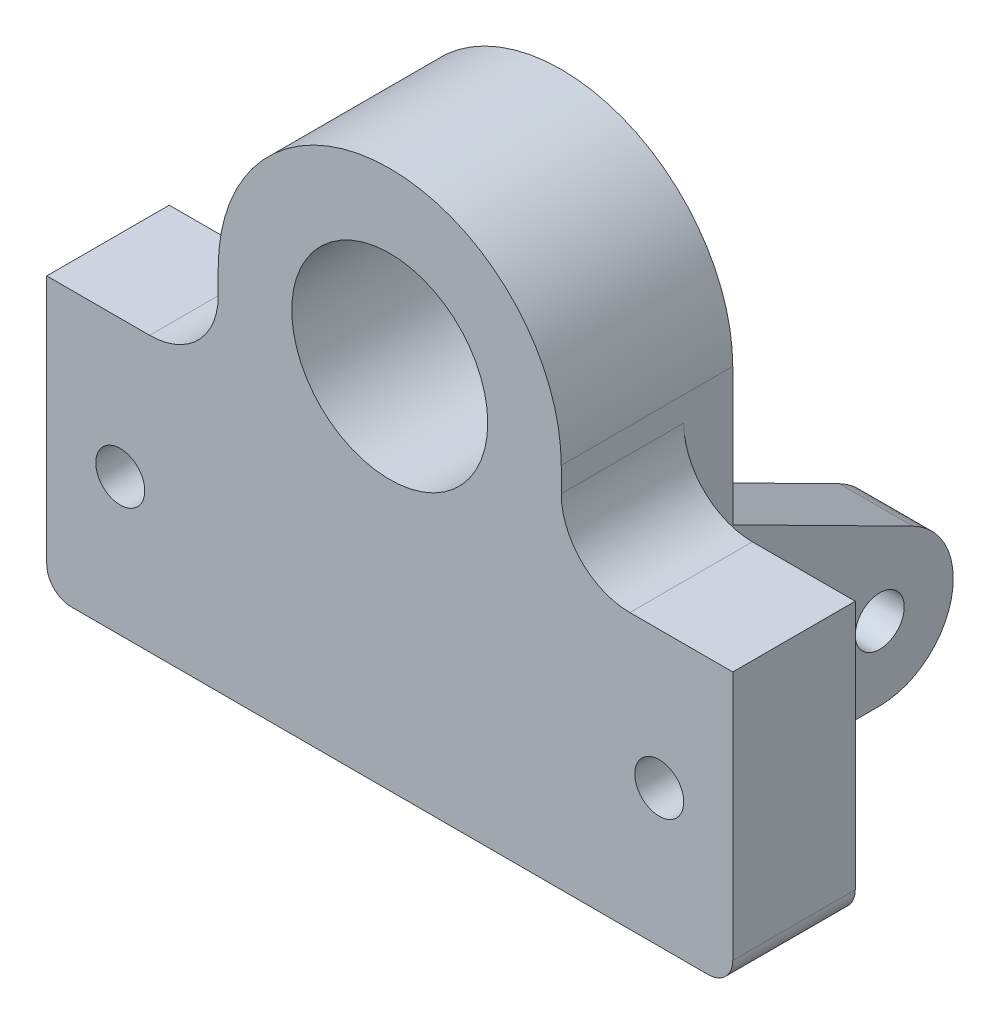
ISO-10303-21;
HEADER;
FILE_DESCRIPTION(('STEP AP214'),'2;1');
FILE_NAME('part.step','',(''),(''),'','','');
FILE_SCHEMA(('AUTOMOTIVE_DESIGN { 1 0 10303 214 1 1 1 1 }'));
ENDSEC;
DATA;
#1=APPLICATION_CONTEXT('core data for automotive mechanical design processes');
#2=APPLICATION_PROTOCOL_DEFINITION('international standard','automotive_design',2000,#1);
#3=PRODUCT_CONTEXT('',#1,'mechanical');
#4=PRODUCT('Part','Part','',(#3));
#5=PRODUCT_RELATED_PRODUCT_CATEGORY('part','',(#4));
#6=PRODUCT_DEFINITION_FORMATION('','',#4);
#7=PRODUCT_DEFINITION_CONTEXT('part definition',#1,'design');
#8=PRODUCT_DEFINITION('design','',#6,#7);
#9=PRODUCT_DEFINITION_SHAPE('','',#8);
#10=(LENGTH_UNIT() NAMED_UNIT(*) SI_UNIT(.MILLI.,.METRE.));
#11=(NAMED_UNIT(*) PLANE_ANGLE_UNIT() SI_UNIT($,.RADIAN.));
#12=(NAMED_UNIT(*) SI_UNIT($,.STERADIAN.) SOLID_ANGLE_UNIT());
#13=UNCERTAINTY_MEASURE_WITH_UNIT(LENGTH_MEASURE(1.E-05),#10,'distance_accuracy_value','');
#14=(GEOMETRIC_REPRESENTATION_CONTEXT(3) GLOBAL_UNCERTAINTY_ASSIGNED_CONTEXT((#13)) GLOBAL_UNIT_ASSIGNED_CONTEXT((#10,
#11,#12)) REPRESENTATION_CONTEXT('',''));
#15=CARTESIAN_POINT('',(0.,0.,0.));
#16=DIRECTION('',(0.,0.,1.));
#17=DIRECTION('',(1.,0.,0.));
#18=AXIS2_PLACEMENT_3D('',#15,#16,#17);
#19=CARTESIAN_POINT('',(0.,0.,-10.));
#20=DIRECTION('',(0.,0.,1.));
#21=DIRECTION('',(1.,0.,0.));
#22=AXIS2_PLACEMENT_3D('',#19,#20,#21);
#23=PLANE('',#22);
#24=CARTESIAN_POINT('',(0.,75.,-10.));
#25=DIRECTION('',(0.,0.,1.));
#26=DIRECTION('',(1.,0.,0.));
#27=AXIS2_PLACEMENT_3D('',#24,#25,#26);
#28=CIRCLE('',#27,20.);
#29=CARTESIAN_POINT('',(20.,75.,-10.));
#30=VERTEX_POINT('',#29);
#31=EDGE_CURVE('E224',#30,#30,#28,.T.);
#32=ORIENTED_EDGE('',*,*,#31,.T.);
#33=EDGE_LOOP('',(#32));
#34=FACE_BOUND('',#33,.T.);
#35=DIRECTION('',(0.,-1.,0.));
#36=VECTOR('',#35,1.);
#37=CARTESIAN_POINT('',(-20.,47.,-10.));
#38=LINE('',#37,#36);
#39=CARTESIAN_POINT('',(-20.,47.,-10.));
#40=VERTEX_POINT('',#39);
#41=CARTESIAN_POINT('',(-20.,0.,-10.));
#42=VERTEX_POINT('',#41);
#43=EDGE_CURVE('E50',#40,#42,#38,.T.);
#44=ORIENTED_EDGE('',*,*,#43,.F.);
#45=DIRECTION('',(-1.,0.,0.));
#46=VECTOR('',#45,1.);
#47=CARTESIAN_POINT('',(-20.,47.,-10.));
#48=LINE('',#47,#46);
#49=CARTESIAN_POINT('',(-35.,47.,-10.));
#50=VERTEX_POINT('',#49);
#51=EDGE_CURVE('E55',#40,#50,#48,.T.);
#52=ORIENTED_EDGE('',*,*,#51,.T.);
#53=DIRECTION('',(0.,-1.,0.));
#54=VECTOR('',#53,1.);
#55=CARTESIAN_POINT('',(-35.,0.,-10.));
#56=LINE('',#55,#54);
#57=CARTESIAN_POINT('',(-35.,75.,-10.));
#58=VERTEX_POINT('',#57);
#59=EDGE_CURVE('E237',#58,#50,#56,.T.);
#60=ORIENTED_EDGE('',*,*,#59,.F.);
#61=CARTESIAN_POINT('',(0.,75.,-10.));
#62=DIRECTION('',(0.,0.,1.));
#63=DIRECTION('',(1.,0.,0.));
#64=AXIS2_PLACEMENT_3D('',#61,#62,#63);
#65=CIRCLE('',#64,35.);
#66=CARTESIAN_POINT('',(35.,75.,-10.));
#67=VERTEX_POINT('',#66);
#68=EDGE_CURVE('E234',#67,#58,#65,.T.);
#69=ORIENTED_EDGE('',*,*,#68,.F.);
#70=DIRECTION('',(0.,-1.,0.));
#71=VECTOR('',#70,1.);
#72=CARTESIAN_POINT('',(35.,0.,-10.));
#73=LINE('',#72,#71);
#74=CARTESIAN_POINT('',(35.,47.,-10.));
#75=VERTEX_POINT('',#74);
#76=EDGE_CURVE('E231',#67,#75,#73,.T.);
#77=ORIENTED_EDGE('',*,*,#76,.T.);
#78=DIRECTION('',(1.,0.,0.));
#79=VECTOR('',#78,1.);
#80=CARTESIAN_POINT('',(20.,47.,-10.));
#81=LINE('',#80,#79);
#82=CARTESIAN_POINT('',(20.,47.,-10.));
#83=VERTEX_POINT('',#82);
#84=EDGE_CURVE('E222',#83,#75,#81,.T.);
#85=ORIENTED_EDGE('',*,*,#84,.F.);
#86=DIRECTION('',(0.,-1.,0.));
#87=VECTOR('',#86,1.);
#88=CARTESIAN_POINT('',(20.,47.,-10.));
#89=LINE('',#88,#87);
#90=CARTESIAN_POINT('',(20.,0.,-10.));
#91=VERTEX_POINT('',#90);
#92=EDGE_CURVE('E214',#83,#91,#89,.T.);
#93=ORIENTED_EDGE('',*,*,#92,.T.);
#94=DIRECTION('',(1.,0.,0.));
#95=VECTOR('',#94,1.);
#96=CARTESIAN_POINT('',(0.,0.,-10.));
#97=LINE('',#96,#95);
#98=EDGE_CURVE('E239',#42,#91,#97,.T.);
#99=ORIENTED_EDGE('',*,*,#98,.F.);
#100=EDGE_LOOP('',(#44,#52,#60,#69,#77,#85,#93,#99));
#101=FACE_BOUND('',#100,.T.);
#102=ADVANCED_FACE('F33',(#34,#101),#23,.F.);
#103=CARTESIAN_POINT('',(0.,0.,0.));
#104=DIRECTION('',(0.,0.,1.));
#105=DIRECTION('',(1.,0.,0.));
#106=AXIS2_PLACEMENT_3D('',#103,#104,#105);
#107=PLANE('',#106);
#108=CARTESIAN_POINT('',(55.,28.,0.));
#109=DIRECTION('',(0.,0.,1.));
#110=DIRECTION('',(1.,0.,0.));
#111=AXIS2_PLACEMENT_3D('',#108,#109,#110);
#112=CIRCLE('',#111,5.);
#113=CARTESIAN_POINT('',(60.,28.,0.));
#114=VERTEX_POINT('',#113);
#115=EDGE_CURVE('E251',#114,#114,#112,.T.);
#116=ORIENTED_EDGE('',*,*,#115,.T.);
#117=EDGE_LOOP('',(#116));
#118=FACE_BOUND('',#117,.T.);
#119=DIRECTION('',(0.,-1.,0.));
#120=VECTOR('',#119,1.);
#121=CARTESIAN_POINT('',(35.,0.,0.));
#122=LINE('',#121,#120);
#123=CARTESIAN_POINT('',(35.,70.,0.));
#124=VERTEX_POINT('',#123);
#125=CARTESIAN_POINT('',(35.,0.,0.));
#126=VERTEX_POINT('',#125);
#127=EDGE_CURVE('E11',#124,#126,#122,.T.);
#128=ORIENTED_EDGE('',*,*,#127,.F.);
#129=CARTESIAN_POINT('',(49.,70.,0.));
#130=DIRECTION('',(0.,0.,1.));
#131=DIRECTION('',(1.,0.,0.));
#132=AXIS2_PLACEMENT_3D('',#129,#130,#131);
#133=CIRCLE('',#132,14.);
#134=CARTESIAN_POINT('',(49.,56.,0.));
#135=VERTEX_POINT('',#134);
#136=EDGE_CURVE('E316',#124,#135,#133,.T.);
#137=ORIENTED_EDGE('',*,*,#136,.T.);
#138=DIRECTION('',(-1.,0.,0.));
#139=VECTOR('',#138,1.);
#140=CARTESIAN_POINT('',(0.,56.,0.));
#141=LINE('',#140,#139);
#142=CARTESIAN_POINT('',(70.,56.,0.));
#143=VERTEX_POINT('',#142);
#144=EDGE_CURVE('E287',#143,#135,#141,.T.);
#145=ORIENTED_EDGE('',*,*,#144,.F.);
#146=DIRECTION('',(0.,1.,0.));
#147=VECTOR('',#146,1.);
#148=CARTESIAN_POINT('',(70.,0.,0.));
#149=LINE('',#148,#147);
#150=CARTESIAN_POINT('',(70.,5.,0.));
#151=VERTEX_POINT('',#150);
#152=EDGE_CURVE('E285',#151,#143,#149,.T.);
#153=ORIENTED_EDGE('',*,*,#152,.F.);
#154=CARTESIAN_POINT('',(65.,5.,0.));
#155=DIRECTION('',(0.,0.,1.));
#156=DIRECTION('',(1.,0.,0.));
#157=AXIS2_PLACEMENT_3D('',#154,#155,#156);
#158=CIRCLE('',#157,5.);
#159=CARTESIAN_POINT('',(65.,0.,0.));
#160=VERTEX_POINT('',#159);
#161=EDGE_CURVE('E330',#151,#160,#158,.F.);
#162=ORIENTED_EDGE('',*,*,#161,.T.);
#163=DIRECTION('',(1.,0.,0.));
#164=VECTOR('',#163,1.);
#165=CARTESIAN_POINT('',(0.,0.,0.));
#166=LINE('',#165,#164);
#167=EDGE_CURVE('E282',#126,#160,#166,.T.);
#168=ORIENTED_EDGE('',*,*,#167,.F.);
#169=EDGE_LOOP('',(#128,#137,#145,#153,#162,#168));
#170=FACE_BOUND('',#169,.T.);
#171=ADVANCED_FACE('F353',(#118,#170),#107,.F.);
#172=CARTESIAN_POINT('',(0.,0.,25.));
#173=DIRECTION('',(0.,1.,0.));
#174=DIRECTION('',(0.,0.,1.));
#175=AXIS2_PLACEMENT_3D('',#172,#173,#174);
#176=PLANE('',#175);
#177=ORIENTED_EDGE('',*,*,#98,.T.);
#178=DIRECTION('',(0.,0.,-1.));
#179=VECTOR('',#178,1.);
#180=CARTESIAN_POINT('',(20.,0.,-10.));
#181=LINE('',#180,#179);
#182=CARTESIAN_POINT('',(20.,0.,-40.));
#183=VERTEX_POINT('',#182);
#184=EDGE_CURVE('E205',#91,#183,#181,.T.);
#185=ORIENTED_EDGE('',*,*,#184,.T.);
#186=DIRECTION('',(1.,0.,0.));
#187=VECTOR('',#186,1.);
#188=CARTESIAN_POINT('',(20.,0.,-40.));
#189=LINE('',#188,#187);
#190=CARTESIAN_POINT('',(35.,0.,-40.));
#191=VERTEX_POINT('',#190);
#192=EDGE_CURVE('E217',#183,#191,#189,.T.);
#193=ORIENTED_EDGE('',*,*,#192,.T.);
#194=DIRECTION('',(0.,0.,1.));
#195=VECTOR('',#194,1.);
#196=CARTESIAN_POINT('',(35.,0.,-10.));
#197=LINE('',#196,#195);
#198=EDGE_CURVE('E243',#191,#126,#197,.T.);
#199=ORIENTED_EDGE('',*,*,#198,.T.);
#200=ORIENTED_EDGE('',*,*,#167,.T.);
#201=DIRECTION('',(0.,0.,-1.));
#202=VECTOR('',#201,1.);
#203=CARTESIAN_POINT('',(65.,0.,25.));
#204=LINE('',#203,#202);
#205=CARTESIAN_POINT('',(65.,0.,25.));
#206=VERTEX_POINT('',#205);
#207=EDGE_CURVE('E325',#160,#206,#204,.F.);
#208=ORIENTED_EDGE('',*,*,#207,.T.);
#209=DIRECTION('',(1.,0.,0.));
#210=VECTOR('',#209,1.);
#211=CARTESIAN_POINT('',(0.,0.,25.));
#212=LINE('',#211,#210);
#213=CARTESIAN_POINT('',(-65.,0.,25.));
#214=VERTEX_POINT('',#213);
#215=EDGE_CURVE('E250',#214,#206,#212,.T.);
#216=ORIENTED_EDGE('',*,*,#215,.F.);
#217=DIRECTION('',(0.,0.,-1.));
#218=VECTOR('',#217,1.);
#219=CARTESIAN_POINT('',(-65.,0.,25.));
#220=LINE('',#219,#218);
#221=CARTESIAN_POINT('',(-65.,0.,0.));
#222=VERTEX_POINT('',#221);
#223=EDGE_CURVE('E327',#214,#222,#220,.T.);
#224=ORIENTED_EDGE('',*,*,#223,.T.);
#225=CARTESIAN_POINT('',(-35.,0.,0.));
#226=VERTEX_POINT('',#225);
#227=EDGE_CURVE('E283',#222,#226,#166,.T.);
#228=ORIENTED_EDGE('',*,*,#227,.T.);
#229=DIRECTION('',(0.,0.,1.));
#230=VECTOR('',#229,1.);
#231=CARTESIAN_POINT('',(-35.,0.,-10.));
#232=LINE('',#231,#230);
#233=CARTESIAN_POINT('',(-35.,0.,-40.));
#234=VERTEX_POINT('',#233);
#235=EDGE_CURVE('E191',#234,#226,#232,.T.);
#236=ORIENTED_EDGE('',*,*,#235,.F.);
#237=DIRECTION('',(-1.,0.,0.));
#238=VECTOR('',#237,1.);
#239=CARTESIAN_POINT('',(-20.,0.,-40.));
#240=LINE('',#239,#238);
#241=CARTESIAN_POINT('',(-20.,0.,-40.));
#242=VERTEX_POINT('',#241);
#243=EDGE_CURVE('E177',#242,#234,#240,.T.);
#244=ORIENTED_EDGE('',*,*,#243,.F.);
#245=DIRECTION('',(0.,0.,-1.));
#246=VECTOR('',#245,1.);
#247=CARTESIAN_POINT('',(-20.,0.,-10.));
#248=LINE('',#247,#246);
#249=EDGE_CURVE('E182',#42,#242,#248,.T.);
#250=ORIENTED_EDGE('',*,*,#249,.F.);
#251=EDGE_LOOP('',(#177,#185,#193,#199,#200,#208,#216,#224,#228,#236,#244,#250));
#252=FACE_BOUND('',#251,.T.);
#253=ADVANCED_FACE('F189',(#252),#176,.F.);
#254=CARTESIAN_POINT('',(70.,0.,25.));
#255=DIRECTION('',(-1.,0.,0.));
#256=DIRECTION('',(0.,0.,1.));
#257=AXIS2_PLACEMENT_3D('',#254,#255,#256);
#258=PLANE('',#257);
#259=DIRECTION('',(0.,1.,0.));
#260=VECTOR('',#259,1.);
#261=CARTESIAN_POINT('',(70.,0.,25.));
#262=LINE('',#261,#260);
#263=CARTESIAN_POINT('',(70.,5.,25.));
#264=VERTEX_POINT('',#263);
#265=CARTESIAN_POINT('',(70.,56.,25.));
#266=VERTEX_POINT('',#265);
#267=EDGE_CURVE('E254',#264,#266,#262,.T.);
#268=ORIENTED_EDGE('',*,*,#267,.F.);
#269=DIRECTION('',(0.,0.,-1.));
#270=VECTOR('',#269,1.);
#271=CARTESIAN_POINT('',(70.,5.,25.));
#272=LINE('',#271,#270);
#273=EDGE_CURVE('E37',#264,#151,#272,.T.);
#274=ORIENTED_EDGE('',*,*,#273,.T.);
#275=ORIENTED_EDGE('',*,*,#152,.T.);
#276=DIRECTION('',(0.,0.,-1.));
#277=VECTOR('',#276,1.);
#278=CARTESIAN_POINT('',(70.,56.,25.));
#279=LINE('',#278,#277);
#280=EDGE_CURVE('E303',#266,#143,#279,.T.);
#281=ORIENTED_EDGE('',*,*,#280,.F.);
#282=EDGE_LOOP('',(#268,#274,#275,#281));
#283=FACE_BOUND('',#282,.T.);
#284=ADVANCED_FACE('F347',(#283),#258,.F.);
#285=CARTESIAN_POINT('',(0.,56.,25.));
#286=DIRECTION('',(0.,-1.,0.));
#287=DIRECTION('',(0.,0.,-1.));
#288=AXIS2_PLACEMENT_3D('',#285,#286,#287);
#289=PLANE('',#288);
#290=ORIENTED_EDGE('',*,*,#144,.T.);
#291=DIRECTION('',(0.,0.,-1.));
#292=VECTOR('',#291,1.);
#293=CARTESIAN_POINT('',(49.,56.,25.));
#294=LINE('',#293,#292);
#295=CARTESIAN_POINT('',(49.,56.,25.));
#296=VERTEX_POINT('',#295);
#297=EDGE_CURVE('E309',#135,#296,#294,.F.);
#298=ORIENTED_EDGE('',*,*,#297,.T.);
#299=DIRECTION('',(-1.,0.,0.));
#300=VECTOR('',#299,1.);
#301=CARTESIAN_POINT('',(0.,56.,25.));
#302=LINE('',#301,#300);
#303=EDGE_CURVE('E256',#266,#296,#302,.T.);
#304=ORIENTED_EDGE('',*,*,#303,.F.);
#305=ORIENTED_EDGE('',*,*,#280,.T.);
#306=EDGE_LOOP('',(#290,#298,#304,#305));
#307=FACE_BOUND('',#306,.T.);
#308=ADVANCED_FACE('F359',(#307),#289,.F.);
#309=CARTESIAN_POINT('',(35.,0.,25.));
#310=DIRECTION('',(1.,0.,0.));
#311=DIRECTION('',(0.,0.,-1.));
#312=AXIS2_PLACEMENT_3D('',#309,#310,#311);
#313=PLANE('',#312);
#314=ORIENTED_EDGE('',*,*,#127,.T.);
#315=ORIENTED_EDGE('',*,*,#198,.F.);
#316=CARTESIAN_POINT('',(35.,15.,-40.));
#317=DIRECTION('',(1.,0.,0.));
#318=DIRECTION('',(0.,0.,-1.));
#319=AXIS2_PLACEMENT_3D('',#316,#317,#318);
#320=CIRCLE('',#319,15.);
#321=CARTESIAN_POINT('',(35.,28.3828053331458,-46.7749923553555));
#322=VERTEX_POINT('',#321);
#323=EDGE_CURVE('E201',#191,#322,#320,.T.);
#324=ORIENTED_EDGE('',*,*,#323,.T.);
#325=DIRECTION('',(0.,0.451666157023699,0.892187022209718));
#326=VECTOR('',#325,1.);
#327=CARTESIAN_POINT('',(35.,28.3828053331458,-46.7749923553555));
#328=LINE('',#327,#326);
#329=EDGE_CURVE('E209',#322,#75,#328,.T.);
#330=ORIENTED_EDGE('',*,*,#329,.T.);
#331=ORIENTED_EDGE('',*,*,#76,.F.);
#332=DIRECTION('',(0.,0.,-1.));
#333=VECTOR('',#332,1.);
#334=CARTESIAN_POINT('',(35.,75.,25.));
#335=LINE('',#334,#333);
#336=CARTESIAN_POINT('',(35.,75.,25.));
#337=VERTEX_POINT('',#336);
#338=EDGE_CURVE('E301',#337,#67,#335,.T.);
#339=ORIENTED_EDGE('',*,*,#338,.F.);
#340=DIRECTION('',(0.,-1.,0.));
#341=VECTOR('',#340,1.);
#342=CARTESIAN_POINT('',(35.,0.,25.));
#343=LINE('',#342,#341);
#344=CARTESIAN_POINT('',(35.,70.,25.));
#345=VERTEX_POINT('',#344);
#346=EDGE_CURVE('E259',#337,#345,#343,.T.);
#347=ORIENTED_EDGE('',*,*,#346,.T.);
#348=DIRECTION('',(0.,0.,-1.));
#349=VECTOR('',#348,1.);
#350=CARTESIAN_POINT('',(35.,70.,25.));
#351=LINE('',#350,#349);
#352=EDGE_CURVE('E306',#345,#124,#351,.T.);
#353=ORIENTED_EDGE('',*,*,#352,.T.);
#354=EDGE_LOOP('',(#314,#315,#324,#330,#331,#339,#347,#353));
#355=FACE_BOUND('',#354,.T.);
#356=CARTESIAN_POINT('',(35.,15.,-40.));
#357=DIRECTION('',(1.,0.,0.));
#358=DIRECTION('',(0.,0.,-1.));
#359=AXIS2_PLACEMENT_3D('',#356,#357,#358);
#360=CIRCLE('',#359,5.);
#361=CARTESIAN_POINT('',(35.,15.,-45.));
#362=VERTEX_POINT('',#361);
#363=EDGE_CURVE('E202',#362,#362,#360,.T.);
#364=ORIENTED_EDGE('',*,*,#363,.F.);
#365=EDGE_LOOP('',(#364));
#366=FACE_BOUND('',#365,.T.);
#367=ADVANCED_FACE('F369',(#355,#366),#313,.T.);
#368=CARTESIAN_POINT('',(0.,75.,25.));
#369=DIRECTION('',(0.,0.,-1.));
#370=DIRECTION('',(-1.,0.,0.));
#371=AXIS2_PLACEMENT_3D('',#368,#369,#370);
#372=CYLINDRICAL_SURFACE('',#371,35.);
#373=ORIENTED_EDGE('',*,*,#338,.T.);
#374=ORIENTED_EDGE('',*,*,#68,.T.);
#375=DIRECTION('',(0.,0.,-1.));
#376=VECTOR('',#375,1.);
#377=CARTESIAN_POINT('',(-35.,75.,25.));
#378=LINE('',#377,#376);
#379=CARTESIAN_POINT('',(-35.,75.,25.));
#380=VERTEX_POINT('',#379);
#381=EDGE_CURVE('E299',#380,#58,#378,.T.);
#382=ORIENTED_EDGE('',*,*,#381,.F.);
#383=CARTESIAN_POINT('',(0.,75.,25.));
#384=DIRECTION('',(0.,0.,1.));
#385=DIRECTION('',(1.,0.,0.));
#386=AXIS2_PLACEMENT_3D('',#383,#384,#385);
#387=CIRCLE('',#386,35.);
#388=EDGE_CURVE('E262',#337,#380,#387,.T.);
#389=ORIENTED_EDGE('',*,*,#388,.F.);
#390=EDGE_LOOP('',(#373,#374,#382,#389));
#391=FACE_BOUND('',#390,.T.);
#392=ADVANCED_FACE('F376',(#391),#372,.T.);
#393=CARTESIAN_POINT('',(-35.,0.,25.));
#394=DIRECTION('',(1.,0.,0.));
#395=DIRECTION('',(0.,0.,-1.));
#396=AXIS2_PLACEMENT_3D('',#393,#394,#395);
#397=PLANE('',#396);
#398=ORIENTED_EDGE('',*,*,#381,.T.);
#399=ORIENTED_EDGE('',*,*,#59,.T.);
#400=DIRECTION('',(0.,0.451666157023699,0.892187022209718));
#401=VECTOR('',#400,1.);
#402=CARTESIAN_POINT('',(-35.,28.3828053331458,-46.7749923553555));
#403=LINE('',#402,#401);
#404=CARTESIAN_POINT('',(-35.,28.3828053331458,-46.7749923553555));
#405=VERTEX_POINT('',#404);
#406=EDGE_CURVE('E187',#405,#50,#403,.T.);
#407=ORIENTED_EDGE('',*,*,#406,.F.);
#408=CARTESIAN_POINT('',(-35.,15.,-40.));
#409=DIRECTION('',(1.,0.,0.));
#410=DIRECTION('',(0.,0.,-1.));
#411=AXIS2_PLACEMENT_3D('',#408,#409,#410);
#412=CIRCLE('',#411,15.);
#413=EDGE_CURVE('E402',#234,#405,#412,.T.);
#414=ORIENTED_EDGE('',*,*,#413,.F.);
#415=ORIENTED_EDGE('',*,*,#235,.T.);
#416=DIRECTION('',(0.,-1.,0.));
#417=VECTOR('',#416,1.);
#418=CARTESIAN_POINT('',(-35.,0.,0.));
#419=LINE('',#418,#417);
#420=CARTESIAN_POINT('',(-35.,70.,0.));
#421=VERTEX_POINT('',#420);
#422=EDGE_CURVE('E42',#421,#226,#419,.T.);
#423=ORIENTED_EDGE('',*,*,#422,.F.);
#424=DIRECTION('',(0.,0.,-1.));
#425=VECTOR('',#424,1.);
#426=CARTESIAN_POINT('',(-35.,70.,25.));
#427=LINE('',#426,#425);
#428=CARTESIAN_POINT('',(-35.,70.,25.));
#429=VERTEX_POINT('',#428);
#430=EDGE_CURVE('E314',#421,#429,#427,.F.);
#431=ORIENTED_EDGE('',*,*,#430,.T.);
#432=DIRECTION('',(0.,-1.,0.));
#433=VECTOR('',#432,1.);
#434=CARTESIAN_POINT('',(-35.,0.,25.));
#435=LINE('',#434,#433);
#436=EDGE_CURVE('E264',#380,#429,#435,.T.);
#437=ORIENTED_EDGE('',*,*,#436,.F.);
#438=EDGE_LOOP('',(#398,#399,#407,#414,#415,#423,#431,#437));
#439=FACE_BOUND('',#438,.T.);
#440=CARTESIAN_POINT('',(-35.,15.,-40.));
#441=DIRECTION('',(1.,0.,0.));
#442=DIRECTION('',(0.,0.,-1.));
#443=AXIS2_PLACEMENT_3D('',#440,#441,#442);
#444=CIRCLE('',#443,5.);
#445=CARTESIAN_POINT('',(-35.,15.,-45.));
#446=VERTEX_POINT('',#445);
#447=EDGE_CURVE('E408',#446,#446,#444,.T.);
#448=ORIENTED_EDGE('',*,*,#447,.T.);
#449=EDGE_LOOP('',(#448));
#450=FACE_BOUND('',#449,.T.);
#451=ADVANCED_FACE('F399',(#439,#450),#397,.F.);
#452=CARTESIAN_POINT('',(0.,56.,25.));
#453=DIRECTION('',(0.,1.,0.));
#454=DIRECTION('',(0.,0.,1.));
#455=AXIS2_PLACEMENT_3D('',#452,#453,#454);
#456=PLANE('',#455);
#457=DIRECTION('',(1.,0.,0.));
#458=VECTOR('',#457,1.);
#459=CARTESIAN_POINT('',(0.,56.,25.));
#460=LINE('',#459,#458);
#461=CARTESIAN_POINT('',(-70.,56.,25.));
#462=VERTEX_POINT('',#461);
#463=CARTESIAN_POINT('',(-49.,56.,25.));
#464=VERTEX_POINT('',#463);
#465=EDGE_CURVE('E267',#462,#464,#460,.T.);
#466=ORIENTED_EDGE('',*,*,#465,.T.);
#467=DIRECTION('',(0.,0.,-1.));
#468=VECTOR('',#467,1.);
#469=CARTESIAN_POINT('',(-49.,56.,25.));
#470=LINE('',#469,#468);
#471=CARTESIAN_POINT('',(-49.,56.,0.));
#472=VERTEX_POINT('',#471);
#473=EDGE_CURVE('E311',#464,#472,#470,.T.);
#474=ORIENTED_EDGE('',*,*,#473,.T.);
#475=DIRECTION('',(1.,0.,0.));
#476=VECTOR('',#475,1.);
#477=CARTESIAN_POINT('',(0.,56.,0.));
#478=LINE('',#477,#476);
#479=CARTESIAN_POINT('',(-70.,56.,0.));
#480=VERTEX_POINT('',#479);
#481=EDGE_CURVE('E290',#480,#472,#478,.T.);
#482=ORIENTED_EDGE('',*,*,#481,.F.);
#483=DIRECTION('',(0.,0.,-1.));
#484=VECTOR('',#483,1.);
#485=CARTESIAN_POINT('',(-70.,56.,25.));
#486=LINE('',#485,#484);
#487=EDGE_CURVE('E279',#462,#480,#486,.T.);
#488=ORIENTED_EDGE('',*,*,#487,.F.);
#489=EDGE_LOOP('',(#466,#474,#482,#488));
#490=FACE_BOUND('',#489,.T.);
#491=ADVANCED_FACE('F387',(#490),#456,.T.);
#492=CARTESIAN_POINT('',(0.,75.,25.));
#493=DIRECTION('',(0.,0.,-1.));
#494=DIRECTION('',(-1.,0.,0.));
#495=AXIS2_PLACEMENT_3D('',#492,#493,#494);
#496=CYLINDRICAL_SURFACE('',#495,20.);
#497=CARTESIAN_POINT('',(0.,75.,25.));
#498=DIRECTION('',(0.,0.,1.));
#499=DIRECTION('',(1.,0.,0.));
#500=AXIS2_PLACEMENT_3D('',#497,#498,#499);
#501=CIRCLE('',#500,20.);
#502=CARTESIAN_POINT('',(20.,75.,25.));
#503=VERTEX_POINT('',#502);
#504=EDGE_CURVE('E273',#503,#503,#501,.T.);
#505=ORIENTED_EDGE('',*,*,#504,.T.);
#506=EDGE_LOOP('',(#505));
#507=FACE_BOUND('',#506,.T.);
#508=ORIENTED_EDGE('',*,*,#31,.F.);
#509=EDGE_LOOP('',(#508));
#510=FACE_BOUND('',#509,.T.);
#511=ADVANCED_FACE('F448',(#507,#510),#496,.F.);
#512=CARTESIAN_POINT('',(-70.,0.,25.));
#513=DIRECTION('',(1.,0.,0.));
#514=DIRECTION('',(0.,0.,-1.));
#515=AXIS2_PLACEMENT_3D('',#512,#513,#514);
#516=PLANE('',#515);
#517=DIRECTION('',(0.,-1.,0.));
#518=VECTOR('',#517,1.);
#519=CARTESIAN_POINT('',(-70.,0.,0.));
#520=LINE('',#519,#518);
#521=CARTESIAN_POINT('',(-70.,5.,0.));
#522=VERTEX_POINT('',#521);
#523=EDGE_CURVE('E293',#480,#522,#520,.T.);
#524=ORIENTED_EDGE('',*,*,#523,.T.);
#525=DIRECTION('',(0.,0.,-1.));
#526=VECTOR('',#525,1.);
#527=CARTESIAN_POINT('',(-70.,5.,25.));
#528=LINE('',#527,#526);
#529=CARTESIAN_POINT('',(-70.,5.,25.));
#530=VERTEX_POINT('',#529);
#531=EDGE_CURVE('E335',#522,#530,#528,.F.);
#532=ORIENTED_EDGE('',*,*,#531,.T.);
#533=DIRECTION('',(0.,-1.,0.));
#534=VECTOR('',#533,1.);
#535=CARTESIAN_POINT('',(-70.,0.,25.));
#536=LINE('',#535,#534);
#537=EDGE_CURVE('E270',#462,#530,#536,.T.);
#538=ORIENTED_EDGE('',*,*,#537,.F.);
#539=ORIENTED_EDGE('',*,*,#487,.T.);
#540=EDGE_LOOP('',(#524,#532,#538,#539));
#541=FACE_BOUND('',#540,.T.);
#542=ADVANCED_FACE('F394',(#541),#516,.F.);
#543=CARTESIAN_POINT('',(-55.,28.,25.));
#544=DIRECTION('',(0.,0.,-1.));
#545=DIRECTION('',(-1.,0.,0.));
#546=AXIS2_PLACEMENT_3D('',#543,#544,#545);
#547=CYLINDRICAL_SURFACE('',#546,5.);
#548=CARTESIAN_POINT('',(-55.,28.,25.));
#549=DIRECTION('',(0.,0.,1.));
#550=DIRECTION('',(1.,0.,0.));
#551=AXIS2_PLACEMENT_3D('',#548,#549,#550);
#552=CIRCLE('',#551,5.);
#553=CARTESIAN_POINT('',(-50.,28.,25.));
#554=VERTEX_POINT('',#553);
#555=EDGE_CURVE('E247',#554,#554,#552,.T.);
#556=ORIENTED_EDGE('',*,*,#555,.T.);
#557=EDGE_LOOP('',(#556));
#558=FACE_BOUND('',#557,.T.);
#559=CARTESIAN_POINT('',(-55.,28.,0.));
#560=DIRECTION('',(0.,0.,1.));
#561=DIRECTION('',(1.,0.,0.));
#562=AXIS2_PLACEMENT_3D('',#559,#560,#561);
#563=CIRCLE('',#562,5.);
#564=CARTESIAN_POINT('',(-50.,28.,0.));
#565=VERTEX_POINT('',#564);
#566=EDGE_CURVE('E245',#565,#565,#563,.T.);
#567=ORIENTED_EDGE('',*,*,#566,.F.);
#568=EDGE_LOOP('',(#567));
#569=FACE_BOUND('',#568,.T.);
#570=ADVANCED_FACE('F446',(#558,#569),#547,.F.);
#571=CARTESIAN_POINT('',(55.,28.,25.));
#572=DIRECTION('',(0.,0.,-1.));
#573=DIRECTION('',(-1.,0.,0.));
#574=AXIS2_PLACEMENT_3D('',#571,#572,#573);
#575=CYLINDRICAL_SURFACE('',#574,5.);
#576=CARTESIAN_POINT('',(55.,28.,25.));
#577=DIRECTION('',(0.,0.,1.));
#578=DIRECTION('',(1.,0.,0.));
#579=AXIS2_PLACEMENT_3D('',#576,#577,#578);
#580=CIRCLE('',#579,5.);
#581=CARTESIAN_POINT('',(60.,28.,25.));
#582=VERTEX_POINT('',#581);
#583=EDGE_CURVE('E276',#582,#582,#580,.T.);
#584=ORIENTED_EDGE('',*,*,#583,.T.);
#585=EDGE_LOOP('',(#584));
#586=FACE_BOUND('',#585,.T.);
#587=ORIENTED_EDGE('',*,*,#115,.F.);
#588=EDGE_LOOP('',(#587));
#589=FACE_BOUND('',#588,.T.);
#590=ADVANCED_FACE('F439',(#586,#589),#575,.F.);
#591=CARTESIAN_POINT('',(0.,0.,25.));
#592=DIRECTION('',(0.,0.,1.));
#593=DIRECTION('',(1.,0.,0.));
#594=AXIS2_PLACEMENT_3D('',#591,#592,#593);
#595=PLANE('',#594);
#596=ORIENTED_EDGE('',*,*,#555,.F.);
#597=EDGE_LOOP('',(#596));
#598=FACE_BOUND('',#597,.T.);
#599=ORIENTED_EDGE('',*,*,#537,.T.);
#600=CARTESIAN_POINT('',(-65.,5.,25.));
#601=DIRECTION('',(0.,0.,1.));
#602=DIRECTION('',(1.,0.,0.));
#603=AXIS2_PLACEMENT_3D('',#600,#601,#602);
#604=CIRCLE('',#603,5.);
#605=EDGE_CURVE('E338',#530,#214,#604,.T.);
#606=ORIENTED_EDGE('',*,*,#605,.T.);
#607=ORIENTED_EDGE('',*,*,#215,.T.);
#608=CARTESIAN_POINT('',(65.,5.,25.));
#609=DIRECTION('',(0.,0.,1.));
#610=DIRECTION('',(1.,0.,0.));
#611=AXIS2_PLACEMENT_3D('',#608,#609,#610);
#612=CIRCLE('',#611,5.);
#613=EDGE_CURVE('E337',#206,#264,#612,.T.);
#614=ORIENTED_EDGE('',*,*,#613,.T.);
#615=ORIENTED_EDGE('',*,*,#267,.T.);
#616=ORIENTED_EDGE('',*,*,#303,.T.);
#617=CARTESIAN_POINT('',(49.,70.,25.));
#618=DIRECTION('',(0.,0.,1.));
#619=DIRECTION('',(1.,0.,0.));
#620=AXIS2_PLACEMENT_3D('',#617,#618,#619);
#621=CIRCLE('',#620,14.);
#622=EDGE_CURVE('E318',#296,#345,#621,.F.);
#623=ORIENTED_EDGE('',*,*,#622,.T.);
#624=ORIENTED_EDGE('',*,*,#346,.F.);
#625=ORIENTED_EDGE('',*,*,#388,.T.);
#626=ORIENTED_EDGE('',*,*,#436,.T.);
#627=CARTESIAN_POINT('',(-49.,70.,25.));
#628=DIRECTION('',(0.,0.,1.));
#629=DIRECTION('',(1.,0.,0.));
#630=AXIS2_PLACEMENT_3D('',#627,#628,#629);
#631=CIRCLE('',#630,14.);
#632=EDGE_CURVE('E323',#429,#464,#631,.F.);
#633=ORIENTED_EDGE('',*,*,#632,.T.);
#634=ORIENTED_EDGE('',*,*,#465,.F.);
#635=EDGE_LOOP('',(#599,#606,#607,#614,#615,#616,#623,#624,#625,#626,#633,#634));
#636=FACE_BOUND('',#635,.T.);
#637=ORIENTED_EDGE('',*,*,#504,.F.);
#638=EDGE_LOOP('',(#637));
#639=FACE_BOUND('',#638,.T.);
#640=ORIENTED_EDGE('',*,*,#583,.F.);
#641=EDGE_LOOP('',(#640));
#642=FACE_BOUND('',#641,.T.);
#643=ADVANCED_FACE('F366',(#598,#636,#639,#642),#595,.T.);
#644=ORIENTED_EDGE('',*,*,#566,.T.);
#645=EDGE_LOOP('',(#644));
#646=FACE_BOUND('',#645,.T.);
#647=CARTESIAN_POINT('',(-49.,70.,0.));
#648=DIRECTION('',(0.,0.,1.));
#649=DIRECTION('',(1.,0.,0.));
#650=AXIS2_PLACEMENT_3D('',#647,#648,#649);
#651=CIRCLE('',#650,14.);
#652=EDGE_CURVE('E320',#472,#421,#651,.T.);
#653=ORIENTED_EDGE('',*,*,#652,.T.);
#654=ORIENTED_EDGE('',*,*,#422,.T.);
#655=ORIENTED_EDGE('',*,*,#227,.F.);
#656=CARTESIAN_POINT('',(-65.,5.,0.));
#657=DIRECTION('',(0.,0.,1.));
#658=DIRECTION('',(1.,0.,0.));
#659=AXIS2_PLACEMENT_3D('',#656,#657,#658);
#660=CIRCLE('',#659,5.);
#661=EDGE_CURVE('E333',#222,#522,#660,.F.);
#662=ORIENTED_EDGE('',*,*,#661,.T.);
#663=ORIENTED_EDGE('',*,*,#523,.F.);
#664=ORIENTED_EDGE('',*,*,#481,.T.);
#665=EDGE_LOOP('',(#653,#654,#655,#662,#663,#664));
#666=FACE_BOUND('',#665,.T.);
#667=ADVANCED_FACE('F390',(#646,#666),#107,.F.);
#668=CARTESIAN_POINT('',(49.,70.,25.));
#669=DIRECTION('',(0.,0.,-1.));
#670=DIRECTION('',(-1.,0.,0.));
#671=AXIS2_PLACEMENT_3D('',#668,#669,#670);
#672=CYLINDRICAL_SURFACE('',#671,14.);
#673=ORIENTED_EDGE('',*,*,#622,.F.);
#674=ORIENTED_EDGE('',*,*,#297,.F.);
#675=ORIENTED_EDGE('',*,*,#136,.F.);
#676=ORIENTED_EDGE('',*,*,#352,.F.);
#677=EDGE_LOOP('',(#673,#674,#675,#676));
#678=FACE_BOUND('',#677,.T.);
#679=ADVANCED_FACE('F363',(#678),#672,.F.);
#680=CARTESIAN_POINT('',(-49.,70.,25.));
#681=DIRECTION('',(0.,0.,-1.));
#682=DIRECTION('',(-1.,0.,0.));
#683=AXIS2_PLACEMENT_3D('',#680,#681,#682);
#684=CYLINDRICAL_SURFACE('',#683,14.);
#685=ORIENTED_EDGE('',*,*,#632,.F.);
#686=ORIENTED_EDGE('',*,*,#430,.F.);
#687=ORIENTED_EDGE('',*,*,#652,.F.);
#688=ORIENTED_EDGE('',*,*,#473,.F.);
#689=EDGE_LOOP('',(#685,#686,#687,#688));
#690=FACE_BOUND('',#689,.T.);
#691=ADVANCED_FACE('F384',(#690),#684,.F.);
#692=CARTESIAN_POINT('',(-65.,5.,25.));
#693=DIRECTION('',(0.,0.,-1.));
#694=DIRECTION('',(-1.,0.,0.));
#695=AXIS2_PLACEMENT_3D('',#692,#693,#694);
#696=CYLINDRICAL_SURFACE('',#695,5.);
#697=ORIENTED_EDGE('',*,*,#605,.F.);
#698=ORIENTED_EDGE('',*,*,#531,.F.);
#699=ORIENTED_EDGE('',*,*,#661,.F.);
#700=ORIENTED_EDGE('',*,*,#223,.F.);
#701=EDGE_LOOP('',(#697,#698,#699,#700));
#702=FACE_BOUND('',#701,.T.);
#703=ADVANCED_FACE('F397',(#702),#696,.T.);
#704=CARTESIAN_POINT('',(65.,5.,25.));
#705=DIRECTION('',(0.,0.,-1.));
#706=DIRECTION('',(-1.,0.,0.));
#707=AXIS2_PLACEMENT_3D('',#704,#705,#706);
#708=CYLINDRICAL_SURFACE('',#707,5.);
#709=ORIENTED_EDGE('',*,*,#613,.F.);
#710=ORIENTED_EDGE('',*,*,#207,.F.);
#711=ORIENTED_EDGE('',*,*,#161,.F.);
#712=ORIENTED_EDGE('',*,*,#273,.F.);
#713=EDGE_LOOP('',(#709,#710,#711,#712));
#714=FACE_BOUND('',#713,.T.);
#715=ADVANCED_FACE('F35',(#714),#708,.T.);
#716=CARTESIAN_POINT('',(20.,28.3828053331458,-46.7749923553555));
#717=DIRECTION('',(0.,0.892187022209718,-0.451666157023699));
#718=DIRECTION('',(0.,0.451666157023699,0.892187022209718));
#719=AXIS2_PLACEMENT_3D('',#716,#717,#718);
#720=PLANE('',#719);
#721=ORIENTED_EDGE('',*,*,#329,.F.);
#722=DIRECTION('',(1.,0.,0.));
#723=VECTOR('',#722,1.);
#724=CARTESIAN_POINT('',(20.,28.3828053331458,-46.7749923553555));
#725=LINE('',#724,#723);
#726=CARTESIAN_POINT('',(20.,28.3828053331458,-46.7749923553555));
#727=VERTEX_POINT('',#726);
#728=EDGE_CURVE('E225',#727,#322,#725,.T.);
#729=ORIENTED_EDGE('',*,*,#728,.F.);
#730=DIRECTION('',(0.,0.451666157023699,0.892187022209718));
#731=VECTOR('',#730,1.);
#732=CARTESIAN_POINT('',(20.,28.3828053331458,-46.7749923553555));
#733=LINE('',#732,#731);
#734=EDGE_CURVE('E212',#727,#83,#733,.T.);
#735=ORIENTED_EDGE('',*,*,#734,.T.);
#736=ORIENTED_EDGE('',*,*,#84,.T.);
#737=EDGE_LOOP('',(#721,#729,#735,#736));
#738=FACE_BOUND('',#737,.T.);
#739=ADVANCED_FACE('F478',(#738),#720,.T.);
#740=CARTESIAN_POINT('',(20.,15.,-40.));
#741=DIRECTION('',(1.,0.,0.));
#742=DIRECTION('',(0.,0.,-1.));
#743=AXIS2_PLACEMENT_3D('',#740,#741,#742);
#744=CYLINDRICAL_SURFACE('',#743,15.);
#745=ORIENTED_EDGE('',*,*,#323,.F.);
#746=ORIENTED_EDGE('',*,*,#192,.F.);
#747=CARTESIAN_POINT('',(20.,15.,-40.));
#748=DIRECTION('',(1.,0.,0.));
#749=DIRECTION('',(0.,0.,-1.));
#750=AXIS2_PLACEMENT_3D('',#747,#748,#749);
#751=CIRCLE('',#750,15.);
#752=EDGE_CURVE('E208',#183,#727,#751,.T.);
#753=ORIENTED_EDGE('',*,*,#752,.T.);
#754=ORIENTED_EDGE('',*,*,#728,.T.);
#755=EDGE_LOOP('',(#745,#746,#753,#754));
#756=FACE_BOUND('',#755,.T.);
#757=ADVANCED_FACE('F436',(#756),#744,.T.);
#758=CARTESIAN_POINT('',(20.,15.,-40.));
#759=DIRECTION('',(1.,0.,0.));
#760=DIRECTION('',(0.,0.,-1.));
#761=AXIS2_PLACEMENT_3D('',#758,#759,#760);
#762=PLANE('',#761);
#763=CARTESIAN_POINT('',(20.,15.,-40.));
#764=DIRECTION('',(1.,0.,0.));
#765=DIRECTION('',(0.,0.,-1.));
#766=AXIS2_PLACEMENT_3D('',#763,#764,#765);
#767=CIRCLE('',#766,5.);
#768=CARTESIAN_POINT('',(20.,15.,-45.));
#769=VERTEX_POINT('',#768);
#770=EDGE_CURVE('E198',#769,#769,#767,.T.);
#771=ORIENTED_EDGE('',*,*,#770,.T.);
#772=EDGE_LOOP('',(#771));
#773=FACE_BOUND('',#772,.T.);
#774=ORIENTED_EDGE('',*,*,#184,.F.);
#775=ORIENTED_EDGE('',*,*,#92,.F.);
#776=ORIENTED_EDGE('',*,*,#734,.F.);
#777=ORIENTED_EDGE('',*,*,#752,.F.);
#778=EDGE_LOOP('',(#774,#775,#776,#777));
#779=FACE_BOUND('',#778,.T.);
#780=ADVANCED_FACE('F502',(#773,#779),#762,.F.);
#781=CARTESIAN_POINT('',(20.,15.,-40.));
#782=DIRECTION('',(1.,0.,0.));
#783=DIRECTION('',(0.,0.,-1.));
#784=AXIS2_PLACEMENT_3D('',#781,#782,#783);
#785=CYLINDRICAL_SURFACE('',#784,5.);
#786=ORIENTED_EDGE('',*,*,#770,.F.);
#787=EDGE_LOOP('',(#786));
#788=FACE_BOUND('',#787,.T.);
#789=ORIENTED_EDGE('',*,*,#363,.T.);
#790=EDGE_LOOP('',(#789));
#791=FACE_BOUND('',#790,.T.);
#792=ADVANCED_FACE('F495',(#788,#791),#785,.F.);
#793=CARTESIAN_POINT('',(-20.,28.3828053331458,-46.7749923553555));
#794=DIRECTION('',(0.,0.892187022209718,-0.451666157023699));
#795=DIRECTION('',(0.,0.451666157023699,0.892187022209718));
#796=AXIS2_PLACEMENT_3D('',#793,#794,#795);
#797=PLANE('',#796);
#798=ORIENTED_EDGE('',*,*,#406,.T.);
#799=ORIENTED_EDGE('',*,*,#51,.F.);
#800=DIRECTION('',(0.,0.451666157023699,0.892187022209718));
#801=VECTOR('',#800,1.);
#802=CARTESIAN_POINT('',(-20.,28.3828053331458,-46.7749923553555));
#803=LINE('',#802,#801);
#804=CARTESIAN_POINT('',(-20.,28.3828053331458,-46.7749923553555));
#805=VERTEX_POINT('',#804);
#806=EDGE_CURVE('E181',#805,#40,#803,.T.);
#807=ORIENTED_EDGE('',*,*,#806,.F.);
#808=DIRECTION('',(-1.,0.,0.));
#809=VECTOR('',#808,1.);
#810=CARTESIAN_POINT('',(-20.,28.3828053331458,-46.7749923553555));
#811=LINE('',#810,#809);
#812=EDGE_CURVE('E178',#805,#405,#811,.T.);
#813=ORIENTED_EDGE('',*,*,#812,.T.);
#814=EDGE_LOOP('',(#798,#799,#807,#813));
#815=FACE_BOUND('',#814,.T.);
#816=ADVANCED_FACE('F493',(#815),#797,.T.);
#817=CARTESIAN_POINT('',(-20.,15.,-40.));
#818=DIRECTION('',(-1.,0.,0.));
#819=DIRECTION('',(0.,0.,-1.));
#820=AXIS2_PLACEMENT_3D('',#817,#818,#819);
#821=CYLINDRICAL_SURFACE('',#820,15.);
#822=ORIENTED_EDGE('',*,*,#413,.T.);
#823=ORIENTED_EDGE('',*,*,#812,.F.);
#824=CARTESIAN_POINT('',(-20.,15.,-40.));
#825=DIRECTION('',(1.,0.,0.));
#826=DIRECTION('',(0.,0.,-1.));
#827=AXIS2_PLACEMENT_3D('',#824,#825,#826);
#828=CIRCLE('',#827,15.);
#829=EDGE_CURVE('E172',#242,#805,#828,.T.);
#830=ORIENTED_EDGE('',*,*,#829,.F.);
#831=ORIENTED_EDGE('',*,*,#243,.T.);
#832=EDGE_LOOP('',(#822,#823,#830,#831));
#833=FACE_BOUND('',#832,.T.);
#834=ADVANCED_FACE('F175',(#833),#821,.T.);
#835=CARTESIAN_POINT('',(-20.,15.,-40.));
#836=DIRECTION('',(-1.,0.,0.));
#837=DIRECTION('',(0.,0.,-1.));
#838=AXIS2_PLACEMENT_3D('',#835,#836,#837);
#839=PLANE('',#838);
#840=CARTESIAN_POINT('',(-20.,15.,-40.));
#841=DIRECTION('',(1.,0.,0.));
#842=DIRECTION('',(0.,0.,-1.));
#843=AXIS2_PLACEMENT_3D('',#840,#841,#842);
#844=CIRCLE('',#843,5.);
#845=CARTESIAN_POINT('',(-20.,15.,-45.));
#846=VERTEX_POINT('',#845);
#847=EDGE_CURVE('E404',#846,#846,#844,.T.);
#848=ORIENTED_EDGE('',*,*,#847,.F.);
#849=EDGE_LOOP('',(#848));
#850=FACE_BOUND('',#849,.T.);
#851=ORIENTED_EDGE('',*,*,#249,.T.);
#852=ORIENTED_EDGE('',*,*,#829,.T.);
#853=ORIENTED_EDGE('',*,*,#806,.T.);
#854=ORIENTED_EDGE('',*,*,#43,.T.);
#855=EDGE_LOOP('',(#851,#852,#853,#854));
#856=FACE_BOUND('',#855,.T.);
#857=ADVANCED_FACE('F185',(#850,#856),#839,.F.);
#858=CARTESIAN_POINT('',(-20.,15.,-40.));
#859=DIRECTION('',(-1.,0.,0.));
#860=DIRECTION('',(0.,0.,-1.));
#861=AXIS2_PLACEMENT_3D('',#858,#859,#860);
#862=CYLINDRICAL_SURFACE('',#861,5.);
#863=ORIENTED_EDGE('',*,*,#847,.T.);
#864=EDGE_LOOP('',(#863));
#865=FACE_BOUND('',#864,.T.);
#866=ORIENTED_EDGE('',*,*,#447,.F.);
#867=EDGE_LOOP('',(#866));
#868=FACE_BOUND('',#867,.T.);
#869=ADVANCED_FACE('F415',(#865,#868),#862,.F.);
#870=CLOSED_SHELL('',(#102,#171,#253,#284,#308,#367,#392,#451,#491,#511,#542,#570,#590,#643,
#667,#679,#691,#703,#715,#739,#757,#780,#792,#816,#834,#857,#869));
#871=MANIFOLD_SOLID_BREP('B2',#870);
#872=ADVANCED_BREP_SHAPE_REPRESENTATION('',(#18,#871),#14);
#873=SHAPE_DEFINITION_REPRESENTATION(#9,#872);
ENDSEC;
END-ISO-10303-21;
